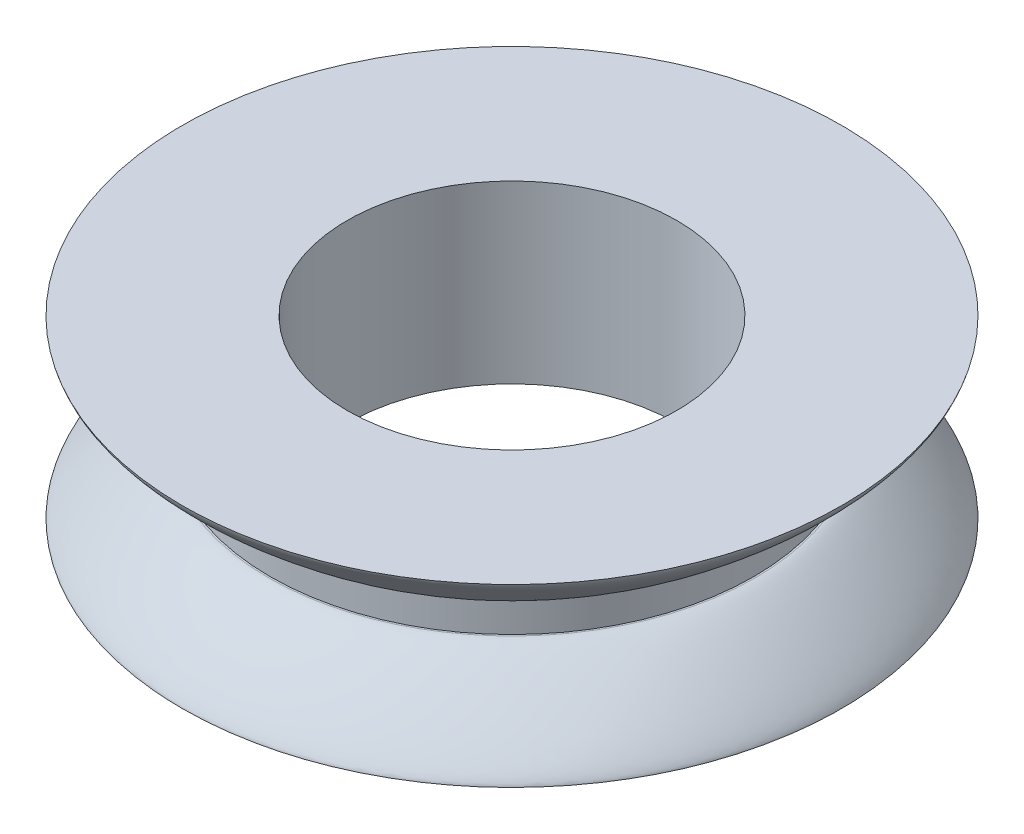
ISO-10303-21;
HEADER;
FILE_DESCRIPTION(('STEP AP214'),'2;1');
FILE_NAME('part.step','',(''),(''),'','','');
FILE_SCHEMA(('AUTOMOTIVE_DESIGN { 1 0 10303 214 1 1 1 1 }'));
ENDSEC;
DATA;
#1=APPLICATION_CONTEXT('core data for automotive mechanical design processes');
#2=APPLICATION_PROTOCOL_DEFINITION('international standard','automotive_design',2000,#1);
#3=PRODUCT_CONTEXT('',#1,'mechanical');
#4=PRODUCT('Part','Part','',(#3));
#5=PRODUCT_RELATED_PRODUCT_CATEGORY('part','',(#4));
#6=PRODUCT_DEFINITION_FORMATION('','',#4);
#7=PRODUCT_DEFINITION_CONTEXT('part definition',#1,'design');
#8=PRODUCT_DEFINITION('design','',#6,#7);
#9=PRODUCT_DEFINITION_SHAPE('','',#8);
#10=(LENGTH_UNIT() NAMED_UNIT(*) SI_UNIT(.MILLI.,.METRE.));
#11=(NAMED_UNIT(*) PLANE_ANGLE_UNIT() SI_UNIT($,.RADIAN.));
#12=(NAMED_UNIT(*) SI_UNIT($,.STERADIAN.) SOLID_ANGLE_UNIT());
#13=UNCERTAINTY_MEASURE_WITH_UNIT(LENGTH_MEASURE(1.E-05),#10,'distance_accuracy_value','');
#14=(GEOMETRIC_REPRESENTATION_CONTEXT(3) GLOBAL_UNCERTAINTY_ASSIGNED_CONTEXT((#13)) GLOBAL_UNIT_ASSIGNED_CONTEXT((#10,
#11,#12)) REPRESENTATION_CONTEXT('',''));
#15=CARTESIAN_POINT('',(0.,0.,0.));
#16=DIRECTION('',(0.,0.,1.));
#17=DIRECTION('',(1.,0.,0.));
#18=AXIS2_PLACEMENT_3D('',#15,#16,#17);
#19=CARTESIAN_POINT('',(0.,5.08,0.));
#20=DIRECTION('',(0.,-1.,0.));
#21=DIRECTION('',(0.,0.,-1.));
#22=AXIS2_PLACEMENT_3D('',#19,#20,#21);
#23=CYLINDRICAL_SURFACE('',#22,4.7625);
#24=CARTESIAN_POINT('',(0.,5.08,0.));
#25=DIRECTION('',(0.,1.,0.));
#26=DIRECTION('',(0.,0.,1.));
#27=AXIS2_PLACEMENT_3D('',#24,#25,#26);
#28=CIRCLE('',#27,4.7625);
#29=CARTESIAN_POINT('',(0.,5.08,4.7625));
#30=VERTEX_POINT('',#29);
#31=EDGE_CURVE('E83',#30,#30,#28,.T.);
#32=ORIENTED_EDGE('',*,*,#31,.T.);
#33=EDGE_LOOP('',(#32));
#34=FACE_BOUND('',#33,.T.);
#35=CARTESIAN_POINT('',(0.,0.,0.));
#36=DIRECTION('',(0.,1.,0.));
#37=DIRECTION('',(0.,0.,1.));
#38=AXIS2_PLACEMENT_3D('',#35,#36,#37);
#39=CIRCLE('',#38,4.7625);
#40=CARTESIAN_POINT('',(0.,0.,4.7625));
#41=VERTEX_POINT('',#40);
#42=EDGE_CURVE('E89',#41,#41,#39,.T.);
#43=ORIENTED_EDGE('',*,*,#42,.F.);
#44=EDGE_LOOP('',(#43));
#45=FACE_BOUND('',#44,.T.);
#46=ADVANCED_FACE('F62',(#34,#45),#23,.F.);
#47=CARTESIAN_POINT('',(0.,5.08,0.));
#48=DIRECTION('',(0.,-1.,0.));
#49=DIRECTION('',(0.,0.,-1.));
#50=AXIS2_PLACEMENT_3D('',#47,#48,#49);
#51=CYLINDRICAL_SURFACE('',#50,6.985);
#52=CARTESIAN_POINT('',(0.,3.048,0.));
#53=DIRECTION('',(0.,1.,0.));
#54=DIRECTION('',(0.,0.,1.));
#55=AXIS2_PLACEMENT_3D('',#52,#53,#54);
#56=CIRCLE('',#55,6.985);
#57=CARTESIAN_POINT('',(0.,3.048,6.985));
#58=VERTEX_POINT('',#57);
#59=EDGE_CURVE('E206',#58,#58,#56,.T.);
#60=ORIENTED_EDGE('',*,*,#59,.F.);
#61=EDGE_LOOP('',(#60));
#62=FACE_BOUND('',#61,.T.);
#63=CARTESIAN_POINT('',(0.,2.032,0.));
#64=DIRECTION('',(0.,1.,0.));
#65=DIRECTION('',(0.,0.,1.));
#66=AXIS2_PLACEMENT_3D('',#63,#64,#65);
#67=CIRCLE('',#66,6.985);
#68=CARTESIAN_POINT('',(0.,2.032,6.985));
#69=VERTEX_POINT('',#68);
#70=EDGE_CURVE('E98',#69,#69,#67,.T.);
#71=ORIENTED_EDGE('',*,*,#70,.T.);
#72=EDGE_LOOP('',(#71));
#73=FACE_BOUND('',#72,.T.);
#74=ADVANCED_FACE('F212',(#62,#73),#51,.T.);
#75=CARTESIAN_POINT('',(0.,5.08,0.));
#76=DIRECTION('',(0.,1.,0.));
#77=DIRECTION('',(0.,0.,1.));
#78=AXIS2_PLACEMENT_3D('',#75,#76,#77);
#79=PLANE('',#78);
#80=ORIENTED_EDGE('',*,*,#31,.F.);
#81=EDGE_LOOP('',(#80));
#82=FACE_BOUND('',#81,.T.);
#83=CARTESIAN_POINT('',(0.,5.08,9.525));
#84=CARTESIAN_POINT('',(-1.24681958019647,5.08,9.525));
#85=CARTESIAN_POINT('',(-2.49314860239987,5.08,9.27708974365963));
#86=CARTESIAN_POINT('',(-4.79697078415512,5.08,8.32281535068037));
#87=CARTESIAN_POINT('',(-5.8535575107288,5.08,7.61682667087533));
#88=CARTESIAN_POINT('',(-7.61682667087497,5.08,5.85355751072836));
#89=CARTESIAN_POINT('',(-8.32281535068038,5.08,4.79697078415549));
#90=CARTESIAN_POINT('',(-9.27708974365964,5.08,2.49314860239944));
#91=CARTESIAN_POINT('',(-9.525,5.08,1.24681958019625));
#92=CARTESIAN_POINT('',(-9.525,5.08,-1.24681958019622));
#93=CARTESIAN_POINT('',(-9.27708974365883,5.08,-2.49314860239947));
#94=CARTESIAN_POINT('',(-8.32281535068117,5.08,-4.79697078415551));
#95=CARTESIAN_POINT('',(-7.61682667087455,5.08,-5.85355751072918));
#96=CARTESIAN_POINT('',(-5.85355751072919,5.08,-7.61682667087454));
#97=CARTESIAN_POINT('',(-4.79697078415509,5.08,-8.32281535068118));
#98=CARTESIAN_POINT('',(-2.49314860239985,5.08,-9.27708974365884));
#99=CARTESIAN_POINT('',(-1.24681958019623,5.08,-9.525));
#100=CARTESIAN_POINT('',(1.24681958019623,5.08,-9.525));
#101=CARTESIAN_POINT('',(2.49314860240067,5.08,-9.27708974366043));
#102=CARTESIAN_POINT('',(4.79697078415432,5.08,-8.32281535067957));
#103=CARTESIAN_POINT('',(5.85355751072838,5.08,-7.61682667087495));
#104=CARTESIAN_POINT('',(7.61682667087534,5.08,-5.85355751072879));
#105=CARTESIAN_POINT('',(8.32281535068032,5.08,-4.7969707841553));
#106=CARTESIAN_POINT('',(9.27708974365969,5.08,-2.49314860239967));
#107=CARTESIAN_POINT('',(9.5249999999992,5.08,-1.24681958019623));
#108=CARTESIAN_POINT('',(9.5250000000008,5.08,1.24681958019623));
#109=CARTESIAN_POINT('',(9.27708974365889,5.0800000000008,2.49314860239906));
#110=CARTESIAN_POINT('',(8.32281535068112,5.0799999999992,4.79697078415589));
#111=CARTESIAN_POINT('',(7.61682667087517,5.08,5.85355751072896));
#112=CARTESIAN_POINT('',(5.85355751072856,5.08,7.61682667087477));
#113=CARTESIAN_POINT('',(4.79697078415535,5.08,8.32281535068014));
#114=CARTESIAN_POINT('',(2.49314860239961,5.08,9.27708974365988));
#115=CARTESIAN_POINT('',(1.24681958019647,5.08,9.525));
#116=CARTESIAN_POINT('',(0.,5.08,9.525));
#117=(BOUNDED_CURVE() B_SPLINE_CURVE(3,(#83,#84,#85,#86,#87,#88,#89,#90,#91,#92,#93,#94,#95,#96,
#97,#98,#99,#100,#101,#102,#103,#104,#105,#106,#107,#108,#109,#110,#111,#112,#113,#114,#115,
#116),.UNSPECIFIED.,.T.,.F.) B_SPLINE_CURVE_WITH_KNOTS((4,2,2,2,2,2,2,2,2,2,2,2,2,2,2,2,4),(0.,
0.392699081698725,0.785398163397448,1.17809724509617,1.5707963267949,1.96349540849362,
2.35619449019234,2.74889357189107,3.14159265358979,3.53429173528852,3.92699081698724,
4.31968989868597,4.71238898038469,5.10508806208341,5.49778714378214,5.89048622548086,
6.28318530717959),
.UNSPECIFIED.) CURVE() GEOMETRIC_REPRESENTATION_ITEM() RATIONAL_B_SPLINE_CURVE((1.,1.,1.,1.,1.,
1.,1.,1.,1.,1.,1.,1.,1.,1.,1.,1.,1.,1.,1.,1.,1.,1.,1.,1.,1.,1.,1.,1.,1.,1.,1.,1.,1.,1.)) REPRESENTATION_ITEM(''));
#118=CARTESIAN_POINT('',(0.,5.08,9.525));
#119=VERTEX_POINT('',#118);
#120=EDGE_CURVE('E134',#119,#119,#117,.F.);
#121=ORIENTED_EDGE('',*,*,#120,.T.);
#122=EDGE_LOOP('',(#121));
#123=FACE_BOUND('',#122,.T.);
#124=ADVANCED_FACE('F120',(#82,#123),#79,.T.);
#125=CARTESIAN_POINT('',(0.,0.,0.));
#126=DIRECTION('',(0.,1.,0.));
#127=DIRECTION('',(0.,0.,1.));
#128=AXIS2_PLACEMENT_3D('',#125,#126,#127);
#129=PLANE('',#128);
#130=ORIENTED_EDGE('',*,*,#42,.T.);
#131=EDGE_LOOP('',(#130));
#132=FACE_BOUND('',#131,.T.);
#133=CARTESIAN_POINT('',(0.,0.,9.525));
#134=CARTESIAN_POINT('',(1.24681958019623,0.,9.525));
#135=CARTESIAN_POINT('',(2.49314860240047,-1.99721300160771E-13,9.27708974365963));
#136=CARTESIAN_POINT('',(4.79697078415452,1.99721300160771E-13,8.32281535068037));
#137=CARTESIAN_POINT('',(5.85355751072878,0.,7.61682667087495));
#138=CARTESIAN_POINT('',(7.61682667087494,0.,5.85355751072879));
#139=CARTESIAN_POINT('',(8.32281535068032,1.50224655989339E-13,4.7969707841553));
#140=CARTESIAN_POINT('',(9.27708974365969,-1.4935729425135E-13,2.49314860239967));
#141=CARTESIAN_POINT('',(9.5250000000008,0.,1.24681958019623));
#142=CARTESIAN_POINT('',(9.5249999999992,0.,-1.24681958019623));
#143=CARTESIAN_POINT('',(9.27708974365889,-3.99551020538167E-13,-2.49314860239906));
#144=CARTESIAN_POINT('',(8.32281535068112,3.9933418010367E-13,-4.79697078415589));
#145=CARTESIAN_POINT('',(7.61682667087397,-1.49899395337593E-13,-5.85355751072936));
#146=CARTESIAN_POINT('',(5.85355751072976,1.49682554903096E-13,-7.61682667087437));
#147=CARTESIAN_POINT('',(4.79697078415575,3.4951227528094E-13,-8.32281535068173));
#148=CARTESIAN_POINT('',(2.49314860239921,-3.4951227528094E-13,-9.27708974365828));
#149=CARTESIAN_POINT('',(1.24681958019647,0.,-9.525));
#150=CARTESIAN_POINT('',(-1.24681958019647,0.,-9.525));
#151=CARTESIAN_POINT('',(-2.49314860240121,-2.99907210892551E-13,-9.27708974365828));
#152=CARTESIAN_POINT('',(-4.79697078415375,2.9925668958906E-13,-8.32281535068173));
#153=CARTESIAN_POINT('',(-5.85355751072736,0.,-7.61682667087597));
#154=CARTESIAN_POINT('',(-7.61682667087636,0.,-5.85355751072777));
#155=CARTESIAN_POINT('',(-8.32281535068192,3.99659440755415E-13,-4.79697078415411));
#156=CARTESIAN_POINT('',(-9.27708974365809,-3.99225759886421E-13,-2.49314860240086));
#157=CARTESIAN_POINT('',(-9.525,0.,-1.24681958019819));
#158=CARTESIAN_POINT('',(-9.525,0.,1.24681958019817));
#159=CARTESIAN_POINT('',(-9.27708974365969,0.,2.49314860239828));
#160=CARTESIAN_POINT('',(-8.32281535068032,0.,4.79697078415671));
#161=CARTESIAN_POINT('',(-7.61682667087455,0.,5.85355751072918));
#162=CARTESIAN_POINT('',(-5.85355751072919,0.,7.61682667087454));
#163=CARTESIAN_POINT('',(-4.79697078415509,1.00185910732131E-13,8.32281535068038));
#164=CARTESIAN_POINT('',(-2.49314860239985,0.,9.27708974365964));
#165=CARTESIAN_POINT('',(-1.24681958019623,0.,9.525));
#166=CARTESIAN_POINT('',(0.,0.,9.525));
#167=(BOUNDED_CURVE() B_SPLINE_CURVE(3,(#133,#134,#135,#136,#137,#138,#139,#140,#141,#142,#143,
#144,#145,#146,#147,#148,#149,#150,#151,#152,#153,#154,#155,#156,#157,#158,#159,#160,#161,#162,
#163,#164,#165,#166),.UNSPECIFIED.,.T.,.F.) B_SPLINE_CURVE_WITH_KNOTS((4,2,2,2,2,2,2,2,2,2,2,2,
2,2,2,2,4),(-3.14159265358979,-2.74889357189107,-2.35619449019234,-1.96349540849362,
-1.5707963267949,-1.17809724509617,-0.785398163397448,-0.392699081698724,0.,0.392699081698724,
0.785398163397448,1.17809724509617,1.5707963267949,1.96349540849362,2.35619449019234,
2.74889357189107,3.14159265358979),
.UNSPECIFIED.) CURVE() GEOMETRIC_REPRESENTATION_ITEM() RATIONAL_B_SPLINE_CURVE((1.,1.,1.,1.,1.,
1.,1.,1.,1.,1.,1.,1.,1.,1.,1.,1.,1.,1.,1.,1.,1.,1.,1.,1.,1.,1.,1.,1.,1.,1.,1.,1.,1.,1.)) REPRESENTATION_ITEM(''));
#168=CARTESIAN_POINT('',(0.,0.,9.525));
#169=VERTEX_POINT('',#168);
#170=EDGE_CURVE('E95',#169,#169,#167,.T.);
#171=ORIENTED_EDGE('',*,*,#170,.F.);
#172=EDGE_LOOP('',(#171));
#173=FACE_BOUND('',#172,.T.);
#174=ADVANCED_FACE('F119',(#132,#173),#129,.F.);
#175=CARTESIAN_POINT('',(0.,2.032,0.));
#176=DIRECTION('',(0.,1.,0.));
#177=DIRECTION('',(0.,0.,1.));
#178=AXIS2_PLACEMENT_3D('',#175,#176,#177);
#179=PLANE('',#178);
#180=CARTESIAN_POINT('',(0.,2.032,7.03631842133229));
#181=CARTESIAN_POINT('',(-0.921051924431762,2.032,7.03631842133229));
#182=CARTESIAN_POINT('',(-1.84174146332652,2.032,6.85318188552895));
#183=CARTESIAN_POINT('',(-3.54362350605177,2.032,6.14823926187313));
#184=CARTESIAN_POINT('',(-4.32414640872154,2.032,5.62671053190223));
#185=CARTESIAN_POINT('',(-5.62671053190224,2.032,4.32414640872153));
#186=CARTESIAN_POINT('',(-6.14823926187287,2.032,3.54362350605285));
#187=CARTESIAN_POINT('',(-6.85318188552918,2.032,1.84174146332547));
#188=CARTESIAN_POINT('',(-7.03631842133229,2.032,0.921051924433197));
#189=CARTESIAN_POINT('',(-7.03631842133229,2.032,-0.921051924433207));
#190=CARTESIAN_POINT('',(-6.85318188552759,2.032,-1.84174146332726));
#191=CARTESIAN_POINT('',(-6.14823926187448,2.032,-3.54362350605105));
#192=CARTESIAN_POINT('',(-5.62671053190361,2.032,-4.32414640872056));
#193=CARTESIAN_POINT('',(-4.32414640872016,2.032,-5.62671053190322));
#194=CARTESIAN_POINT('',(-3.54362350605078,2.032,-6.14823926187394));
#195=CARTESIAN_POINT('',(-1.84174146332752,2.032,-6.85318188552813));
#196=CARTESIAN_POINT('',(-0.921051924431941,2.032,-7.03631842133229));
#197=CARTESIAN_POINT('',(0.921051924431941,2.032,-7.03631842133229));
#198=CARTESIAN_POINT('',(1.84174146332593,2.032,-6.85318188552773));
#199=CARTESIAN_POINT('',(3.54362350605238,2.032,-6.14823926187434));
#200=CARTESIAN_POINT('',(4.32414640872216,2.032,-5.62671053190202));
#201=CARTESIAN_POINT('',(5.62671053190162,2.032,-4.32414640872175));
#202=CARTESIAN_POINT('',(6.14823926187408,2.032,-3.54362350605244));
#203=CARTESIAN_POINT('',(6.85318188552799,2.032,-1.84174146332586));
#204=CARTESIAN_POINT('',(7.03631842133149,2.032,-0.921051924431764));
#205=CARTESIAN_POINT('',(7.03631842133309,2.032,0.921051924431763));
#206=CARTESIAN_POINT('',(6.85318188552879,2.032,1.84174146332626));
#207=CARTESIAN_POINT('',(6.14823926187328,2.032,3.54362350605205));
#208=CARTESIAN_POINT('',(5.62671053190263,2.032,4.32414640872114));
#209=CARTESIAN_POINT('',(4.32414640872113,2.032,5.62671053190264));
#210=CARTESIAN_POINT('',(3.54362350605099,2.032,6.14823926187272));
#211=CARTESIAN_POINT('',(1.84174146332733,2.032,6.85318188552934));
#212=CARTESIAN_POINT('',(0.921051924431764,2.032,7.03631842133229));
#213=CARTESIAN_POINT('',(0.,2.032,7.03631842133229));
#214=(BOUNDED_CURVE() B_SPLINE_CURVE(3,(#180,#181,#182,#183,#184,#185,#186,#187,#188,#189,#190,
#191,#192,#193,#194,#195,#196,#197,#198,#199,#200,#201,#202,#203,#204,#205,#206,#207,#208,#209,
#210,#211,#212,#213),.UNSPECIFIED.,.T.,.F.) B_SPLINE_CURVE_WITH_KNOTS((4,2,2,2,2,2,2,2,2,2,2,2,
2,2,2,2,4),(-3.14159265358979,-2.74889357189107,-2.35619449019234,-1.96349540849362,
-1.5707963267949,-1.17809724509617,-0.785398163397448,-0.392699081698724,0.,0.392699081698724,
0.785398163397448,1.17809724509617,1.5707963267949,1.96349540849362,2.35619449019234,
2.74889357189107,3.14159265358979),
.UNSPECIFIED.) CURVE() GEOMETRIC_REPRESENTATION_ITEM() RATIONAL_B_SPLINE_CURVE((1.,1.,1.,1.,1.,
1.,1.,1.,1.,1.,1.,1.,1.,1.,1.,1.,1.,1.,1.,1.,1.,1.,1.,1.,1.,1.,1.,1.,1.,1.,1.,1.,1.,1.)) REPRESENTATION_ITEM(''));
#215=CARTESIAN_POINT('',(0.,2.032,7.03631842133229));
#216=VERTEX_POINT('',#215);
#217=EDGE_CURVE('E12',#216,#216,#214,.F.);
#218=ORIENTED_EDGE('',*,*,#217,.T.);
#219=EDGE_LOOP('',(#218));
#220=FACE_BOUND('',#219,.T.);
#221=ORIENTED_EDGE('',*,*,#70,.F.);
#222=EDGE_LOOP('',(#221));
#223=FACE_BOUND('',#222,.T.);
#224=ADVANCED_FACE('F115',(#220,#223),#179,.T.);
#225=CARTESIAN_POINT('',(0.,3.048,0.));
#226=DIRECTION('',(0.,-1.,0.));
#227=DIRECTION('',(0.,0.,1.));
#228=AXIS2_PLACEMENT_3D('',#225,#226,#227);
#229=PLANE('',#228);
#230=CARTESIAN_POINT('',(0.,3.048,7.03631842133229));
#231=CARTESIAN_POINT('',(0.921051924431941,3.048,7.03631842133229));
#232=CARTESIAN_POINT('',(1.84174146332653,3.048,6.85318188552932));
#233=CARTESIAN_POINT('',(3.54362350605178,3.048,6.14823926187274));
#234=CARTESIAN_POINT('',(4.32414640872136,3.048,5.62671053190241));
#235=CARTESIAN_POINT('',(5.62671053190241,3.048,4.32414640872136));
#236=CARTESIAN_POINT('',(6.14823926187408,3.048,3.54362350605244));
#237=CARTESIAN_POINT('',(6.85318188552799,3.048,1.84174146332586));
#238=CARTESIAN_POINT('',(7.03631842133309,3.048,0.921051924431763));
#239=CARTESIAN_POINT('',(7.03631842133149,3.048,-0.921051924431763));
#240=CARTESIAN_POINT('',(6.85318188552879,3.048,-1.84174146332626));
#241=CARTESIAN_POINT('',(6.14823926187328,3.048,-3.54362350605205));
#242=CARTESIAN_POINT('',(5.62671053190303,3.048,-4.32414640872114));
#243=CARTESIAN_POINT('',(4.32414640872074,3.048,-5.62671053190264));
#244=CARTESIAN_POINT('',(3.54362350605099,3.048,-6.14823926187192));
#245=CARTESIAN_POINT('',(1.84174146332733,3.048,-6.85318188553013));
#246=CARTESIAN_POINT('',(0.921051924431764,3.048,-7.03631842133229));
#247=CARTESIAN_POINT('',(-0.921051924431762,3.048,-7.03631842133229));
#248=CARTESIAN_POINT('',(-1.84174146332652,3.048,-6.85318188552855));
#249=CARTESIAN_POINT('',(-3.54362350605177,3.048,-6.14823926187353));
#250=CARTESIAN_POINT('',(-4.32414640872154,3.048,-5.62671053190223));
#251=CARTESIAN_POINT('',(-5.62671053190224,3.048,-4.32414640872153));
#252=CARTESIAN_POINT('',(-6.14823926187352,3.048,-3.54362350605198));
#253=CARTESIAN_POINT('',(-6.85318188552854,3.048,-1.84174146332634));
#254=CARTESIAN_POINT('',(-7.03631842133229,3.048,-0.921051924431753));
#255=CARTESIAN_POINT('',(-7.03631842133229,3.048,0.921051924431775));
#256=CARTESIAN_POINT('',(-6.85318188552895,3.048,1.84174146332632));
#257=CARTESIAN_POINT('',(-6.14823926187313,3.048,3.54362350605196));
#258=CARTESIAN_POINT('',(-5.62671053190265,3.048,4.32414640872072));
#259=CARTESIAN_POINT('',(-4.32414640872115,3.048,5.62671053190302));
#260=CARTESIAN_POINT('',(-3.54362350605139,3.048,6.14823926187272));
#261=CARTESIAN_POINT('',(-1.84174146332694,3.048,6.85318188552934));
#262=CARTESIAN_POINT('',(-0.921051924431942,3.048,7.03631842133229));
#263=CARTESIAN_POINT('',(0.,3.048,7.03631842133229));
#264=(BOUNDED_CURVE() B_SPLINE_CURVE(3,(#230,#231,#232,#233,#234,#235,#236,#237,#238,#239,#240,
#241,#242,#243,#244,#245,#246,#247,#248,#249,#250,#251,#252,#253,#254,#255,#256,#257,#258,#259,
#260,#261,#262,#263),.UNSPECIFIED.,.T.,.F.) B_SPLINE_CURVE_WITH_KNOTS((4,2,2,2,2,2,2,2,2,2,2,2,
2,2,2,2,4),(0.,0.392699081698724,0.785398163397448,1.17809724509617,1.5707963267949,
1.96349540849362,2.35619449019234,2.74889357189107,3.14159265358979,3.53429173528852,
3.92699081698724,4.31968989868597,4.71238898038469,5.10508806208341,5.49778714378214,
5.89048622548086,6.28318530717959),
.UNSPECIFIED.) CURVE() GEOMETRIC_REPRESENTATION_ITEM() RATIONAL_B_SPLINE_CURVE((1.,1.,1.,1.,1.,
1.,1.,1.,1.,1.,1.,1.,1.,1.,1.,1.,1.,1.,1.,1.,1.,1.,1.,1.,1.,1.,1.,1.,1.,1.,1.,1.,1.,1.)) REPRESENTATION_ITEM(''));
#265=CARTESIAN_POINT('',(0.,3.048,7.03631842133229));
#266=VERTEX_POINT('',#265);
#267=EDGE_CURVE('E77',#266,#266,#264,.F.);
#268=ORIENTED_EDGE('',*,*,#267,.T.);
#269=EDGE_LOOP('',(#268));
#270=FACE_BOUND('',#269,.T.);
#271=ORIENTED_EDGE('',*,*,#59,.T.);
#272=EDGE_LOOP('',(#271));
#273=FACE_BOUND('',#272,.T.);
#274=ADVANCED_FACE('F105',(#270,#273),#229,.T.);
#275=CARTESIAN_POINT('',(0.,5.08,9.525));
#276=CARTESIAN_POINT('',(1.24681958019647,5.08,9.525));
#277=CARTESIAN_POINT('',(2.49314860239961,5.08,9.27708974365988));
#278=CARTESIAN_POINT('',(4.79697078415535,5.08,8.32281535068014));
#279=CARTESIAN_POINT('',(5.85355751072856,5.08,7.61682667087477));
#280=CARTESIAN_POINT('',(7.61682667087517,5.08,5.85355751072896));
#281=CARTESIAN_POINT('',(8.32281535068112,5.0799999999992,4.79697078415589));
#282=CARTESIAN_POINT('',(9.27708974365889,5.0800000000008,2.49314860239906));
#283=CARTESIAN_POINT('',(9.5250000000008,5.08,1.24681958019623));
#284=CARTESIAN_POINT('',(9.5249999999992,5.08,-1.24681958019623));
#285=CARTESIAN_POINT('',(9.27708974365969,5.08,-2.49314860239967));
#286=CARTESIAN_POINT('',(8.32281535068032,5.08,-4.7969707841553));
#287=CARTESIAN_POINT('',(7.61682667087534,5.08,-5.85355751072879));
#288=CARTESIAN_POINT('',(5.85355751072838,5.08,-7.61682667087495));
#289=CARTESIAN_POINT('',(4.79697078415432,5.08,-8.32281535067957));
#290=CARTESIAN_POINT('',(2.49314860240067,5.08,-9.27708974366043));
#291=CARTESIAN_POINT('',(1.24681958019623,5.08,-9.525));
#292=CARTESIAN_POINT('',(-1.24681958019623,5.08,-9.525));
#293=CARTESIAN_POINT('',(-2.49314860239985,5.08,-9.27708974365884));
#294=CARTESIAN_POINT('',(-4.79697078415509,5.08,-8.32281535068118));
#295=CARTESIAN_POINT('',(-5.85355751072919,5.08,-7.61682667087454));
#296=CARTESIAN_POINT('',(-7.61682667087455,5.08,-5.85355751072918));
#297=CARTESIAN_POINT('',(-8.32281535068117,5.08,-4.79697078415551));
#298=CARTESIAN_POINT('',(-9.27708974365883,5.08,-2.49314860239947));
#299=CARTESIAN_POINT('',(-9.525,5.08,-1.24681958019622));
#300=CARTESIAN_POINT('',(-9.525,5.08,1.24681958019625));
#301=CARTESIAN_POINT('',(-9.27708974365964,5.08,2.49314860239944));
#302=CARTESIAN_POINT('',(-8.32281535068038,5.08,4.79697078415549));
#303=CARTESIAN_POINT('',(-7.61682667087497,5.08,5.85355751072836));
#304=CARTESIAN_POINT('',(-5.8535575107288,5.08,7.61682667087533));
#305=CARTESIAN_POINT('',(-4.79697078415512,5.08,8.32281535068037));
#306=CARTESIAN_POINT('',(-2.49314860239987,5.08,9.27708974365963));
#307=CARTESIAN_POINT('',(-1.24681958019647,5.08,9.525));
#308=CARTESIAN_POINT('',(0.,5.08,9.525));
#309=CARTESIAN_POINT('',(0.,3.048,9.11021973688872));
#310=CARTESIAN_POINT('',(1.19252497090238,3.048,9.11021973688872));
#311=CARTESIAN_POINT('',(2.38458074588763,3.048,8.87310510063752));
#312=CARTESIAN_POINT('',(4.58807957113789,3.048,7.96038600254617));
#313=CARTESIAN_POINT('',(5.59865566039369,3.0480000000002,7.28514064771258));
#314=CARTESIAN_POINT('',(7.28514064771337,3.0479999999998,5.59865566039449));
#315=CARTESIAN_POINT('',(7.96038600254555,3.0479999999998,4.58807957113845));
#316=CARTESIAN_POINT('',(8.87310510063814,3.0480000000002,2.38458074588706));
#317=CARTESIAN_POINT('',(9.11021973688952,3.048,1.19252497090215));
#318=CARTESIAN_POINT('',(9.11021973688792,3.048,-1.19252497090215));
#319=CARTESIAN_POINT('',(8.87310510063814,3.048,-2.38458074588746));
#320=CARTESIAN_POINT('',(7.96038600254555,3.048,-4.58807957113806));
#321=CARTESIAN_POINT('',(7.28514064771309,3.048,-5.59865566039398));
#322=CARTESIAN_POINT('',(5.59865566039397,3.048,-7.2851406477131));
#323=CARTESIAN_POINT('',(4.58807957113719,3.0479999999996,-7.96038600254563));
#324=CARTESIAN_POINT('',(2.38458074588835,3.0480000000004,-8.87310510063805));
#325=CARTESIAN_POINT('',(1.19252497090216,3.048,-9.11021973688872));
#326=CARTESIAN_POINT('',(-1.19252497090215,3.048,-9.11021973688872));
#327=CARTESIAN_POINT('',(-2.38458074588772,3.048,-8.87310510063726));
#328=CARTESIAN_POINT('',(-4.58807957113777,3.048,-7.96038600254644));
#329=CARTESIAN_POINT('',(-5.59865566039438,3.048,-7.28514064771229));
#330=CARTESIAN_POINT('',(-7.2851406477127,3.048,-5.59865566039477));
#331=CARTESIAN_POINT('',(-7.96038600254643,3.048,-4.58807957113819));
#332=CARTESIAN_POINT('',(-8.87310510063725,3.048,-2.38458074588735));
#333=CARTESIAN_POINT('',(-9.11021973688872,3.048,-1.19252497090214));
#334=CARTESIAN_POINT('',(-9.11021973688872,3.048,1.19252497090217));
#335=CARTESIAN_POINT('',(-8.87310510063726,3.0480000000006,2.38458074588712));
#336=CARTESIAN_POINT('',(-7.96038600254644,3.0479999999994,4.58807957113837));
#337=CARTESIAN_POINT('',(-7.28514064771271,3.048,5.59865566039356));
#338=CARTESIAN_POINT('',(-5.59865566039439,3.048,7.28514064771347));
#339=CARTESIAN_POINT('',(-4.58807957113779,3.0479999999996,7.96038600254563));
#340=CARTESIAN_POINT('',(-2.38458074588775,3.0480000000004,8.87310510063805));
#341=CARTESIAN_POINT('',(-1.19252497090238,3.048,9.11021973688872));
#342=CARTESIAN_POINT('',(0.,3.048,9.11021973688872));
#343=CARTESIAN_POINT('',(0.,3.048,7.03631842133229));
#344=CARTESIAN_POINT('',(0.921051924431941,3.048,7.03631842133229));
#345=CARTESIAN_POINT('',(1.84174146332653,3.048,6.85318188552932));
#346=CARTESIAN_POINT('',(3.54362350605178,3.048,6.14823926187274));
#347=CARTESIAN_POINT('',(4.32414640872136,3.048,5.62671053190241));
#348=CARTESIAN_POINT('',(5.62671053190241,3.048,4.32414640872136));
#349=CARTESIAN_POINT('',(6.14823926187408,3.048,3.54362350605244));
#350=CARTESIAN_POINT('',(6.85318188552799,3.048,1.84174146332586));
#351=CARTESIAN_POINT('',(7.03631842133309,3.048,0.921051924431763));
#352=CARTESIAN_POINT('',(7.03631842133149,3.048,-0.921051924431763));
#353=CARTESIAN_POINT('',(6.85318188552879,3.048,-1.84174146332626));
#354=CARTESIAN_POINT('',(6.14823926187328,3.048,-3.54362350605205));
#355=CARTESIAN_POINT('',(5.62671053190303,3.048,-4.32414640872114));
#356=CARTESIAN_POINT('',(4.32414640872074,3.048,-5.62671053190264));
#357=CARTESIAN_POINT('',(3.54362350605099,3.048,-6.14823926187192));
#358=CARTESIAN_POINT('',(1.84174146332733,3.048,-6.85318188553013));
#359=CARTESIAN_POINT('',(0.921051924431764,3.048,-7.03631842133229));
#360=CARTESIAN_POINT('',(-0.921051924431762,3.048,-7.03631842133229));
#361=CARTESIAN_POINT('',(-1.84174146332652,3.048,-6.85318188552855));
#362=CARTESIAN_POINT('',(-3.54362350605177,3.048,-6.14823926187353));
#363=CARTESIAN_POINT('',(-4.32414640872154,3.048,-5.62671053190223));
#364=CARTESIAN_POINT('',(-5.62671053190224,3.048,-4.32414640872153));
#365=CARTESIAN_POINT('',(-6.14823926187352,3.048,-3.54362350605198));
#366=CARTESIAN_POINT('',(-6.85318188552854,3.048,-1.84174146332634));
#367=CARTESIAN_POINT('',(-7.03631842133229,3.048,-0.921051924431753));
#368=CARTESIAN_POINT('',(-7.03631842133229,3.048,0.921051924431775));
#369=CARTESIAN_POINT('',(-6.85318188552895,3.048,1.84174146332632));
#370=CARTESIAN_POINT('',(-6.14823926187313,3.048,3.54362350605196));
#371=CARTESIAN_POINT('',(-5.62671053190265,3.048,4.32414640872072));
#372=CARTESIAN_POINT('',(-4.32414640872115,3.048,5.62671053190302));
#373=CARTESIAN_POINT('',(-3.54362350605139,3.048,6.14823926187272));
#374=CARTESIAN_POINT('',(-1.84174146332694,3.048,6.85318188552934));
#375=CARTESIAN_POINT('',(-0.921051924431942,3.048,7.03631842133229));
#376=CARTESIAN_POINT('',(0.,3.048,7.03631842133229));
#377=(BOUNDED_SURFACE() B_SPLINE_SURFACE(2,3,((#275,#276,#277,#278,#279,#280,#281,#282,#283,
#284,#285,#286,#287,#288,#289,#290,#291,#292,#293,#294,#295,#296,#297,#298,#299,#300,#301,#302,
#303,#304,#305,#306,#307,#308),(#309,#310,#311,#312,#313,#314,#315,#316,#317,#318,#319,#320,
#321,#322,#323,#324,#325,#326,#327,#328,#329,#330,#331,#332,#333,#334,#335,#336,#337,#338,#339,
#340,#341,#342),(#343,#344,#345,#346,#347,#348,#349,#350,#351,#352,#353,#354,#355,#356,#357,
#358,#359,#360,#361,#362,#363,#364,#365,#366,#367,#368,#369,#370,#371,#372,#373,#374,#375,
#376)),.UNSPECIFIED.,.F.,.T.,.F.) B_SPLINE_SURFACE_WITH_KNOTS((3,3),(4,2,2,2,2,2,2,2,2,2,2,2,2,
2,2,2,4),(0.,1.),(0.,0.392699081698724,0.785398163397448,1.17809724509617,1.5707963267949,
1.96349540849362,2.35619449019234,2.74889357189107,3.14159265358979,3.53429173528852,
3.92699081698724,4.31968989868597,4.71238898038469,5.10508806208341,5.49778714378214,
5.89048622548086,6.28318530717959),
.UNSPECIFIED.) GEOMETRIC_REPRESENTATION_ITEM() RATIONAL_B_SPLINE_SURFACE(((1.,1.,1.,1.,1.,1.,1.,
1.,1.,1.,1.,1.,1.,1.,1.,1.,1.,1.,1.,1.,1.,1.,1.,1.,1.,1.,1.,1.,1.,1.,1.,1.,1.,1.),
(0.176470588235294,0.176470588235294,0.176470588235294,0.176470588235294,0.176470588235294,
0.176470588235294,0.176470588235294,0.176470588235294,0.176470588235294,0.176470588235294,
0.176470588235294,0.176470588235294,0.176470588235294,0.176470588235294,0.176470588235294,
0.176470588235294,0.176470588235294,0.176470588235294,0.176470588235294,0.176470588235294,
0.176470588235294,0.176470588235294,0.176470588235294,0.176470588235294,0.176470588235294,
0.176470588235294,0.176470588235294,0.176470588235294,0.176470588235294,0.176470588235294,
0.176470588235294,0.176470588235294,0.176470588235294,0.176470588235294),(1.,1.,1.,1.,1.,1.,1.,
1.,1.,1.,1.,1.,1.,1.,1.,1.,1.,1.,1.,1.,1.,1.,1.,1.,1.,1.,1.,1.,1.,1.,1.,1.,1.,1.))) REPRESENTATION_ITEM('') SURFACE());
#378=ORIENTED_EDGE('',*,*,#267,.F.);
#379=EDGE_LOOP('',(#378));
#380=FACE_BOUND('',#379,.T.);
#381=ORIENTED_EDGE('',*,*,#120,.F.);
#382=EDGE_LOOP('',(#381));
#383=FACE_BOUND('',#382,.T.);
#384=ADVANCED_FACE('F114',(#380,#383),#377,.T.);
#385=CARTESIAN_POINT('',(0.,0.,9.525));
#386=CARTESIAN_POINT('',(-1.24681958019623,0.,9.525));
#387=CARTESIAN_POINT('',(-2.49314860239985,0.,9.27708974365964));
#388=CARTESIAN_POINT('',(-4.79697078415509,1.00185910732131E-13,8.32281535068038));
#389=CARTESIAN_POINT('',(-5.85355751072919,0.,7.61682667087454));
#390=CARTESIAN_POINT('',(-7.61682667087455,0.,5.85355751072918));
#391=CARTESIAN_POINT('',(-8.32281535068032,0.,4.79697078415671));
#392=CARTESIAN_POINT('',(-9.27708974365969,0.,2.49314860239828));
#393=CARTESIAN_POINT('',(-9.525,0.,1.24681958019817));
#394=CARTESIAN_POINT('',(-9.525,0.,-1.24681958019819));
#395=CARTESIAN_POINT('',(-9.27708974365809,-3.99225759886421E-13,-2.49314860240086));
#396=CARTESIAN_POINT('',(-8.32281535068192,3.99659440755415E-13,-4.79697078415411));
#397=CARTESIAN_POINT('',(-7.61682667087636,0.,-5.85355751072777));
#398=CARTESIAN_POINT('',(-5.85355751072736,0.,-7.61682667087597));
#399=CARTESIAN_POINT('',(-4.79697078415375,2.9925668958906E-13,-8.32281535068173));
#400=CARTESIAN_POINT('',(-2.49314860240121,-2.99907210892551E-13,-9.27708974365828));
#401=CARTESIAN_POINT('',(-1.24681958019647,0.,-9.525));
#402=CARTESIAN_POINT('',(1.24681958019647,0.,-9.525));
#403=CARTESIAN_POINT('',(2.49314860239921,-3.4951227528094E-13,-9.27708974365828));
#404=CARTESIAN_POINT('',(4.79697078415575,3.4951227528094E-13,-8.32281535068173));
#405=CARTESIAN_POINT('',(5.85355751072976,1.49682554903096E-13,-7.61682667087437));
#406=CARTESIAN_POINT('',(7.61682667087397,-1.49899395337593E-13,-5.85355751072936));
#407=CARTESIAN_POINT('',(8.32281535068112,3.9933418010367E-13,-4.79697078415589));
#408=CARTESIAN_POINT('',(9.27708974365889,-3.99551020538167E-13,-2.49314860239906));
#409=CARTESIAN_POINT('',(9.5249999999992,0.,-1.24681958019623));
#410=CARTESIAN_POINT('',(9.5250000000008,0.,1.24681958019623));
#411=CARTESIAN_POINT('',(9.27708974365969,-1.4935729425135E-13,2.49314860239967));
#412=CARTESIAN_POINT('',(8.32281535068032,1.50224655989339E-13,4.7969707841553));
#413=CARTESIAN_POINT('',(7.61682667087494,0.,5.85355751072879));
#414=CARTESIAN_POINT('',(5.85355751072878,0.,7.61682667087495));
#415=CARTESIAN_POINT('',(4.79697078415452,1.99721300160771E-13,8.32281535068037));
#416=CARTESIAN_POINT('',(2.49314860240047,-1.99721300160771E-13,9.27708974365963));
#417=CARTESIAN_POINT('',(1.24681958019623,0.,9.525));
#418=CARTESIAN_POINT('',(0.,0.,9.525));
#419=CARTESIAN_POINT('',(0.,2.032,9.11021973688872));
#420=CARTESIAN_POINT('',(-1.19252497090215,2.032,9.11021973688872));
#421=CARTESIAN_POINT('',(-2.38458074588752,2.0319999999998,8.87310510063806));
#422=CARTESIAN_POINT('',(-4.58807957113797,2.0320000000002,7.96038600254564));
#423=CARTESIAN_POINT('',(-5.59865566039478,2.0320000000002,7.28514064771269));
#424=CARTESIAN_POINT('',(-7.2851406477123,2.0319999999998,5.59865566039437));
#425=CARTESIAN_POINT('',(-7.96038600254554,2.0320000000002,4.58807957113947));
#426=CARTESIAN_POINT('',(-8.87310510063814,2.0319999999998,2.38458074588608));
#427=CARTESIAN_POINT('',(-9.11021973688872,2.032,1.19252497090401));
#428=CARTESIAN_POINT('',(-9.11021973688872,2.032,-1.19252497090402));
#429=CARTESIAN_POINT('',(-8.87310510063654,2.032,-2.38458074588886));
#430=CARTESIAN_POINT('',(-7.96038600254715,2.032,-4.58807957113666));
#431=CARTESIAN_POINT('',(-7.28514064771417,2.032,-5.5986556603933));
#432=CARTESIAN_POINT('',(-5.59865566039289,2.032,-7.28514064771378));
#433=CARTESIAN_POINT('',(-4.58807957113649,2.032,-7.96038600254697));
#434=CARTESIAN_POINT('',(-2.38458074588903,2.032,-8.87310510063672));
#435=CARTESIAN_POINT('',(-1.19252497090238,2.032,-9.11021973688872));
#436=CARTESIAN_POINT('',(1.19252497090238,2.032,-9.11021973688872));
#437=CARTESIAN_POINT('',(2.38458074588703,2.032,-8.87310510063592));
#438=CARTESIAN_POINT('',(4.58807957113849,2.032,-7.96038600254777));
#439=CARTESIAN_POINT('',(5.59865566039529,2.032,-7.28514064771218));
#440=CARTESIAN_POINT('',(7.28514064771178,2.032,-5.59865566039489));
#441=CARTESIAN_POINT('',(7.96038600254715,2.032,-4.58807957113865));
#442=CARTESIAN_POINT('',(8.87310510063655,2.032,-2.38458074588686));
#443=CARTESIAN_POINT('',(9.11021973688792,2.032,-1.19252497090216));
#444=CARTESIAN_POINT('',(9.11021973688952,2.032,1.19252497090215));
#445=CARTESIAN_POINT('',(8.87310510063814,2.032,2.38458074588766));
#446=CARTESIAN_POINT('',(7.96038600254555,2.032,4.58807957113786));
#447=CARTESIAN_POINT('',(7.28514064771309,2.0320000000002,5.59865566039438));
#448=CARTESIAN_POINT('',(5.59865566039397,2.0319999999998,7.2851406477127));
#449=CARTESIAN_POINT('',(4.58807957113719,2.032,7.96038600254563));
#450=CARTESIAN_POINT('',(2.38458074588835,2.032,8.87310510063805));
#451=CARTESIAN_POINT('',(1.19252497090215,2.032,9.11021973688872));
#452=CARTESIAN_POINT('',(0.,2.032,9.11021973688872));
#453=CARTESIAN_POINT('',(0.,2.032,7.03631842133229));
#454=CARTESIAN_POINT('',(-0.921051924431762,2.032,7.03631842133229));
#455=CARTESIAN_POINT('',(-1.84174146332652,2.032,6.85318188552895));
#456=CARTESIAN_POINT('',(-3.54362350605177,2.032,6.14823926187313));
#457=CARTESIAN_POINT('',(-4.32414640872154,2.032,5.62671053190223));
#458=CARTESIAN_POINT('',(-5.62671053190224,2.032,4.32414640872153));
#459=CARTESIAN_POINT('',(-6.14823926187287,2.032,3.54362350605285));
#460=CARTESIAN_POINT('',(-6.85318188552918,2.032,1.84174146332547));
#461=CARTESIAN_POINT('',(-7.03631842133229,2.032,0.921051924433197));
#462=CARTESIAN_POINT('',(-7.03631842133229,2.032,-0.921051924433207));
#463=CARTESIAN_POINT('',(-6.85318188552759,2.032,-1.84174146332726));
#464=CARTESIAN_POINT('',(-6.14823926187448,2.032,-3.54362350605105));
#465=CARTESIAN_POINT('',(-5.62671053190361,2.032,-4.32414640872056));
#466=CARTESIAN_POINT('',(-4.32414640872016,2.032,-5.62671053190322));
#467=CARTESIAN_POINT('',(-3.54362350605078,2.032,-6.14823926187394));
#468=CARTESIAN_POINT('',(-1.84174146332752,2.032,-6.85318188552813));
#469=CARTESIAN_POINT('',(-0.921051924431941,2.032,-7.03631842133229));
#470=CARTESIAN_POINT('',(0.921051924431941,2.032,-7.03631842133229));
#471=CARTESIAN_POINT('',(1.84174146332593,2.032,-6.85318188552773));
#472=CARTESIAN_POINT('',(3.54362350605238,2.032,-6.14823926187434));
#473=CARTESIAN_POINT('',(4.32414640872216,2.032,-5.62671053190202));
#474=CARTESIAN_POINT('',(5.62671053190162,2.032,-4.32414640872175));
#475=CARTESIAN_POINT('',(6.14823926187408,2.032,-3.54362350605244));
#476=CARTESIAN_POINT('',(6.85318188552799,2.032,-1.84174146332586));
#477=CARTESIAN_POINT('',(7.03631842133149,2.032,-0.921051924431764));
#478=CARTESIAN_POINT('',(7.03631842133309,2.032,0.921051924431763));
#479=CARTESIAN_POINT('',(6.85318188552879,2.032,1.84174146332626));
#480=CARTESIAN_POINT('',(6.14823926187328,2.032,3.54362350605205));
#481=CARTESIAN_POINT('',(5.62671053190263,2.032,4.32414640872114));
#482=CARTESIAN_POINT('',(4.32414640872113,2.032,5.62671053190264));
#483=CARTESIAN_POINT('',(3.54362350605099,2.032,6.14823926187272));
#484=CARTESIAN_POINT('',(1.84174146332733,2.032,6.85318188552934));
#485=CARTESIAN_POINT('',(0.921051924431764,2.032,7.03631842133229));
#486=CARTESIAN_POINT('',(0.,2.032,7.03631842133229));
#487=(BOUNDED_SURFACE() B_SPLINE_SURFACE(2,3,((#385,#386,#387,#388,#389,#390,#391,#392,#393,
#394,#395,#396,#397,#398,#399,#400,#401,#402,#403,#404,#405,#406,#407,#408,#409,#410,#411,#412,
#413,#414,#415,#416,#417,#418),(#419,#420,#421,#422,#423,#424,#425,#426,#427,#428,#429,#430,
#431,#432,#433,#434,#435,#436,#437,#438,#439,#440,#441,#442,#443,#444,#445,#446,#447,#448,#449,
#450,#451,#452),(#453,#454,#455,#456,#457,#458,#459,#460,#461,#462,#463,#464,#465,#466,#467,
#468,#469,#470,#471,#472,#473,#474,#475,#476,#477,#478,#479,#480,#481,#482,#483,#484,#485,
#486)),.UNSPECIFIED.,.F.,.T.,.F.) B_SPLINE_SURFACE_WITH_KNOTS((3,3),(4,2,2,2,2,2,2,2,2,2,2,2,2,
2,2,2,4),(0.,1.),(-3.14159265358979,-2.74889357189107,-2.35619449019234,-1.96349540849362,
-1.5707963267949,-1.17809724509617,-0.785398163397448,-0.392699081698724,0.,0.392699081698724,
0.785398163397448,1.17809724509617,1.5707963267949,1.96349540849362,2.35619449019234,
2.74889357189107,3.14159265358979),
.UNSPECIFIED.) GEOMETRIC_REPRESENTATION_ITEM() RATIONAL_B_SPLINE_SURFACE(((1.,1.,1.,1.,1.,1.,1.,
1.,1.,1.,1.,1.,1.,1.,1.,1.,1.,1.,1.,1.,1.,1.,1.,1.,1.,1.,1.,1.,1.,1.,1.,1.,1.,1.),
(0.176470588235294,0.176470588235294,0.176470588235294,0.176470588235294,0.176470588235294,
0.176470588235294,0.176470588235294,0.176470588235294,0.176470588235294,0.176470588235294,
0.176470588235294,0.176470588235294,0.176470588235294,0.176470588235294,0.176470588235294,
0.176470588235294,0.176470588235294,0.176470588235294,0.176470588235294,0.176470588235294,
0.176470588235294,0.176470588235294,0.176470588235294,0.176470588235294,0.176470588235294,
0.176470588235294,0.176470588235294,0.176470588235294,0.176470588235294,0.176470588235294,
0.176470588235294,0.176470588235294,0.176470588235294,0.176470588235294),(1.,1.,1.,1.,1.,1.,1.,
1.,1.,1.,1.,1.,1.,1.,1.,1.,1.,1.,1.,1.,1.,1.,1.,1.,1.,1.,1.,1.,1.,1.,1.,1.,1.,1.))) REPRESENTATION_ITEM('') SURFACE());
#488=ORIENTED_EDGE('',*,*,#170,.T.);
#489=EDGE_LOOP('',(#488));
#490=FACE_BOUND('',#489,.T.);
#491=ORIENTED_EDGE('',*,*,#217,.F.);
#492=EDGE_LOOP('',(#491));
#493=FACE_BOUND('',#492,.T.);
#494=ADVANCED_FACE('F65',(#490,#493),#487,.T.);
#495=CLOSED_SHELL('',(#46,#74,#124,#174,#224,#274,#384,#494));
#496=MANIFOLD_SOLID_BREP('B2',#495);
#497=ADVANCED_BREP_SHAPE_REPRESENTATION('',(#18,#496),#14);
#498=SHAPE_DEFINITION_REPRESENTATION(#9,#497);
ENDSEC;
END-ISO-10303-21;
